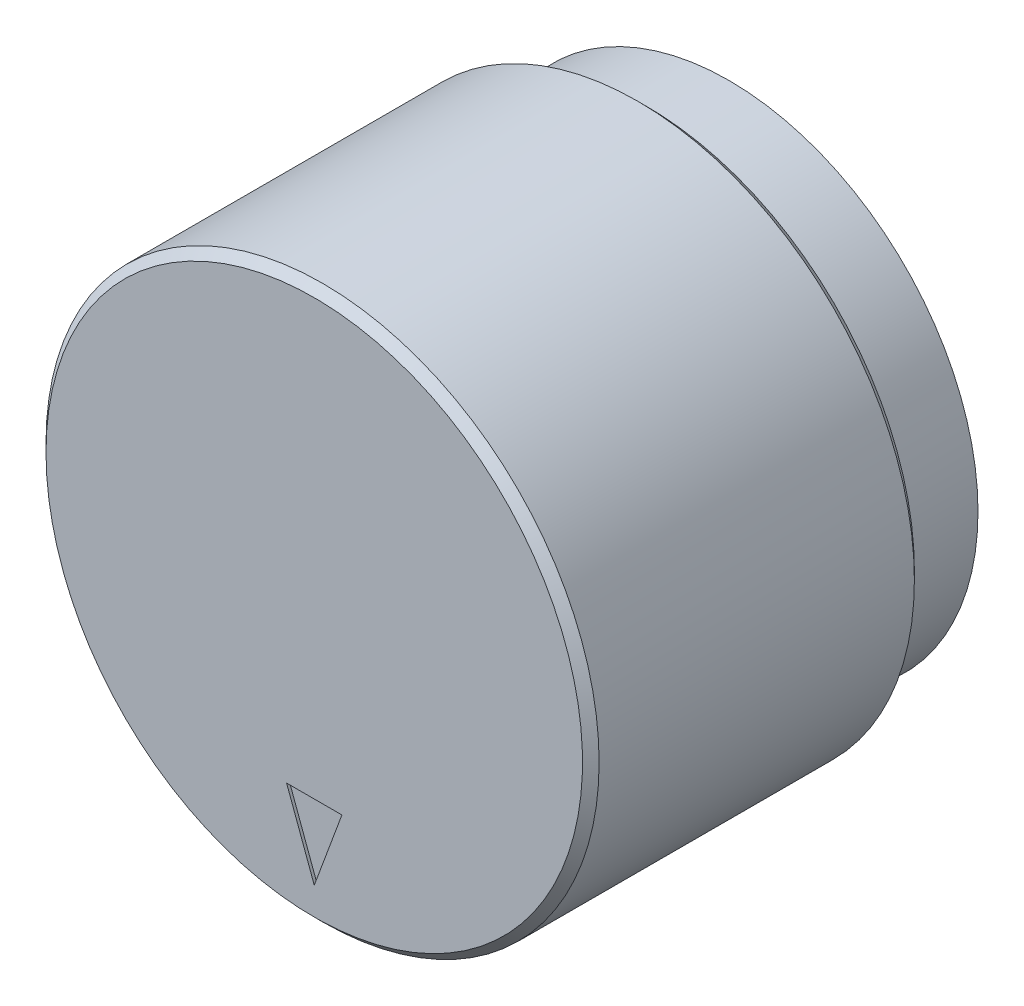
ISO-10303-21;
HEADER;
FILE_DESCRIPTION(('STEP AP214'),'2;1');
FILE_NAME('part.step','',(''),(''),'','','');
FILE_SCHEMA(('AUTOMOTIVE_DESIGN { 1 0 10303 214 1 1 1 1 }'));
ENDSEC;
DATA;
#1=APPLICATION_CONTEXT('core data for automotive mechanical design processes');
#2=APPLICATION_PROTOCOL_DEFINITION('international standard','automotive_design',2000,#1);
#3=PRODUCT_CONTEXT('',#1,'mechanical');
#4=PRODUCT('Part','Part','',(#3));
#5=PRODUCT_RELATED_PRODUCT_CATEGORY('part','',(#4));
#6=PRODUCT_DEFINITION_FORMATION('','',#4);
#7=PRODUCT_DEFINITION_CONTEXT('part definition',#1,'design');
#8=PRODUCT_DEFINITION('design','',#6,#7);
#9=PRODUCT_DEFINITION_SHAPE('','',#8);
#10=(LENGTH_UNIT() NAMED_UNIT(*) SI_UNIT(.MILLI.,.METRE.));
#11=(NAMED_UNIT(*) PLANE_ANGLE_UNIT() SI_UNIT($,.RADIAN.));
#12=(NAMED_UNIT(*) SI_UNIT($,.STERADIAN.) SOLID_ANGLE_UNIT());
#13=UNCERTAINTY_MEASURE_WITH_UNIT(LENGTH_MEASURE(1.E-05),#10,'distance_accuracy_value','');
#14=(GEOMETRIC_REPRESENTATION_CONTEXT(3) GLOBAL_UNCERTAINTY_ASSIGNED_CONTEXT((#13)) GLOBAL_UNIT_ASSIGNED_CONTEXT((#10,
#11,#12)) REPRESENTATION_CONTEXT('',''));
#15=CARTESIAN_POINT('',(0.,0.,0.));
#16=DIRECTION('',(0.,0.,1.));
#17=DIRECTION('',(1.,0.,0.));
#18=AXIS2_PLACEMENT_3D('',#15,#16,#17);
#19=CARTESIAN_POINT('',(0.,0.,12.));
#20=DIRECTION('',(0.,0.,-1.));
#21=DIRECTION('',(-1.,0.,0.));
#22=AXIS2_PLACEMENT_3D('',#19,#20,#21);
#23=CYLINDRICAL_SURFACE('',#22,10.);
#24=CARTESIAN_POINT('',(0.,0.,11.7));
#25=DIRECTION('',(0.,0.,1.));
#26=DIRECTION('',(1.,0.,0.));
#27=AXIS2_PLACEMENT_3D('',#24,#25,#26);
#28=CIRCLE('',#27,10.);
#29=CARTESIAN_POINT('',(-10.,0.,11.7));
#30=VERTEX_POINT('',#29);
#31=EDGE_CURVE('E63',#30,#30,#28,.F.);
#32=ORIENTED_EDGE('',*,*,#31,.T.);
#33=EDGE_LOOP('',(#32));
#34=FACE_BOUND('',#33,.T.);
#35=CARTESIAN_POINT('',(0.,0.,0.299999999999996));
#36=DIRECTION('',(0.,0.,1.));
#37=DIRECTION('',(1.,0.,0.));
#38=AXIS2_PLACEMENT_3D('',#35,#36,#37);
#39=CIRCLE('',#38,10.);
#40=CARTESIAN_POINT('',(10.,0.,0.299999999999996));
#41=VERTEX_POINT('',#40);
#42=EDGE_CURVE('E153',#41,#41,#39,.T.);
#43=ORIENTED_EDGE('',*,*,#42,.T.);
#44=EDGE_LOOP('',(#43));
#45=FACE_BOUND('',#44,.T.);
#46=ADVANCED_FACE('F53',(#34,#45),#23,.T.);
#47=CARTESIAN_POINT('',(0.,0.,12.));
#48=DIRECTION('',(0.,0.,1.));
#49=DIRECTION('',(1.,0.,0.));
#50=AXIS2_PLACEMENT_3D('',#47,#48,#49);
#51=PLANE('',#50);
#52=DIRECTION('',(0.347314355823595,-0.937748760723703,0.));
#53=VECTOR('',#52,1.);
#54=CARTESIAN_POINT('',(-0.999999999999998,-6.,12.));
#55=LINE('',#54,#53);
#56=CARTESIAN_POINT('',(-0.999999999999998,-6.,12.));
#57=VERTEX_POINT('',#56);
#58=CARTESIAN_POINT('',(0.,-8.7,12.));
#59=VERTEX_POINT('',#58);
#60=EDGE_CURVE('E70',#57,#59,#55,.T.);
#61=ORIENTED_EDGE('',*,*,#60,.F.);
#62=DIRECTION('',(-1.,0.,0.));
#63=VECTOR('',#62,1.);
#64=CARTESIAN_POINT('',(-0.999999999999998,-6.,12.));
#65=LINE('',#64,#63);
#66=CARTESIAN_POINT('',(1.,-6.,12.));
#67=VERTEX_POINT('',#66);
#68=EDGE_CURVE('E109',#67,#57,#65,.T.);
#69=ORIENTED_EDGE('',*,*,#68,.F.);
#70=DIRECTION('',(0.347314355823595,0.937748760723703,0.));
#71=VECTOR('',#70,1.);
#72=CARTESIAN_POINT('',(0.,-8.7,12.));
#73=LINE('',#72,#71);
#74=EDGE_CURVE('E112',#59,#67,#73,.T.);
#75=ORIENTED_EDGE('',*,*,#74,.F.);
#76=EDGE_LOOP('',(#61,#69,#75));
#77=FACE_BOUND('',#76,.T.);
#78=CARTESIAN_POINT('',(0.,0.,12.));
#79=DIRECTION('',(0.,0.,1.));
#80=DIRECTION('',(1.,0.,0.));
#81=AXIS2_PLACEMENT_3D('',#78,#79,#80);
#82=CIRCLE('',#81,9.7);
#83=CARTESIAN_POINT('',(-9.7,0.,12.));
#84=VERTEX_POINT('',#83);
#85=EDGE_CURVE('E149',#84,#84,#82,.T.);
#86=ORIENTED_EDGE('',*,*,#85,.T.);
#87=EDGE_LOOP('',(#86));
#88=FACE_BOUND('',#87,.T.);
#89=ADVANCED_FACE('F168',(#77,#88),#51,.T.);
#90=CARTESIAN_POINT('',(0.,0.,0.));
#91=DIRECTION('',(0.,0.,1.));
#92=DIRECTION('',(1.,0.,0.));
#93=AXIS2_PLACEMENT_3D('',#90,#91,#92);
#94=PLANE('',#93);
#95=CARTESIAN_POINT('',(0.,0.,0.));
#96=DIRECTION('',(0.,0.,1.));
#97=DIRECTION('',(1.,0.,0.));
#98=AXIS2_PLACEMENT_3D('',#95,#96,#97);
#99=CIRCLE('',#98,9.7);
#100=CARTESIAN_POINT('',(9.7,0.,0.));
#101=VERTEX_POINT('',#100);
#102=EDGE_CURVE('E11',#101,#101,#99,.F.);
#103=ORIENTED_EDGE('',*,*,#102,.T.);
#104=EDGE_LOOP('',(#103));
#105=FACE_BOUND('',#104,.T.);
#106=CARTESIAN_POINT('',(0.,0.,0.));
#107=DIRECTION('',(0.,0.,1.));
#108=DIRECTION('',(1.,0.,0.));
#109=AXIS2_PLACEMENT_3D('',#106,#107,#108);
#110=CIRCLE('',#109,9.);
#111=CARTESIAN_POINT('',(9.,0.,0.));
#112=VERTEX_POINT('',#111);
#113=EDGE_CURVE('E145',#112,#112,#110,.F.);
#114=ORIENTED_EDGE('',*,*,#113,.F.);
#115=EDGE_LOOP('',(#114));
#116=FACE_BOUND('',#115,.T.);
#117=ADVANCED_FACE('F170',(#105,#116),#94,.F.);
#118=CARTESIAN_POINT('',(0.,0.,-3.));
#119=DIRECTION('',(0.,0.,-1.));
#120=DIRECTION('',(-1.,0.,0.));
#121=AXIS2_PLACEMENT_3D('',#118,#119,#120);
#122=PLANE('',#121);
#123=CARTESIAN_POINT('',(0.,0.,-3.));
#124=DIRECTION('',(0.,0.,-1.));
#125=DIRECTION('',(-1.,0.,0.));
#126=AXIS2_PLACEMENT_3D('',#123,#124,#125);
#127=CIRCLE('',#126,9.);
#128=CARTESIAN_POINT('',(-9.,0.,-3.));
#129=VERTEX_POINT('',#128);
#130=EDGE_CURVE('E138',#129,#129,#127,.T.);
#131=ORIENTED_EDGE('',*,*,#130,.T.);
#132=EDGE_LOOP('',(#131));
#133=FACE_BOUND('',#132,.T.);
#134=CARTESIAN_POINT('',(0.,0.,-3.));
#135=DIRECTION('',(0.,0.,-1.));
#136=DIRECTION('',(-1.,0.,0.));
#137=AXIS2_PLACEMENT_3D('',#134,#135,#136);
#138=CIRCLE('',#137,8.);
#139=CARTESIAN_POINT('',(-8.,0.,-3.));
#140=VERTEX_POINT('',#139);
#141=EDGE_CURVE('E134',#140,#140,#138,.T.);
#142=ORIENTED_EDGE('',*,*,#141,.F.);
#143=EDGE_LOOP('',(#142));
#144=FACE_BOUND('',#143,.T.);
#145=ADVANCED_FACE('F178',(#133,#144),#122,.T.);
#146=CARTESIAN_POINT('',(0.,0.,-3.));
#147=DIRECTION('',(0.,0.,1.));
#148=DIRECTION('',(1.,0.,0.));
#149=AXIS2_PLACEMENT_3D('',#146,#147,#148);
#150=CYLINDRICAL_SURFACE('',#149,9.);
#151=ORIENTED_EDGE('',*,*,#130,.F.);
#152=EDGE_LOOP('',(#151));
#153=FACE_BOUND('',#152,.T.);
#154=ORIENTED_EDGE('',*,*,#113,.T.);
#155=EDGE_LOOP('',(#154));
#156=FACE_BOUND('',#155,.T.);
#157=ADVANCED_FACE('F185',(#153,#156),#150,.T.);
#158=CARTESIAN_POINT('',(0.,0.,-3.));
#159=DIRECTION('',(0.,0.,1.));
#160=DIRECTION('',(1.,0.,0.));
#161=AXIS2_PLACEMENT_3D('',#158,#159,#160);
#162=CYLINDRICAL_SURFACE('',#161,8.);
#163=ORIENTED_EDGE('',*,*,#141,.T.);
#164=EDGE_LOOP('',(#163));
#165=FACE_BOUND('',#164,.T.);
#166=CARTESIAN_POINT('',(0.,0.,0.));
#167=DIRECTION('',(0.,0.,-1.));
#168=DIRECTION('',(-1.,0.,0.));
#169=AXIS2_PLACEMENT_3D('',#166,#167,#168);
#170=CIRCLE('',#169,8.);
#171=CARTESIAN_POINT('',(-8.,0.,0.));
#172=VERTEX_POINT('',#171);
#173=EDGE_CURVE('E130',#172,#172,#170,.T.);
#174=ORIENTED_EDGE('',*,*,#173,.F.);
#175=EDGE_LOOP('',(#174));
#176=FACE_BOUND('',#175,.T.);
#177=ADVANCED_FACE('F193',(#165,#176),#162,.F.);
#178=CARTESIAN_POINT('',(0.,0.,0.));
#179=DIRECTION('',(0.,0.,-1.));
#180=DIRECTION('',(-1.,0.,0.));
#181=AXIS2_PLACEMENT_3D('',#178,#179,#180);
#182=CIRCLE('',#181,3.);
#183=CARTESIAN_POINT('',(-3.,0.,0.));
#184=VERTEX_POINT('',#183);
#185=EDGE_CURVE('E123',#184,#184,#182,.T.);
#186=ORIENTED_EDGE('',*,*,#185,.F.);
#187=EDGE_LOOP('',(#186));
#188=FACE_BOUND('',#187,.T.);
#189=ORIENTED_EDGE('',*,*,#173,.T.);
#190=EDGE_LOOP('',(#189));
#191=FACE_BOUND('',#190,.T.);
#192=ADVANCED_FACE('F181',(#188,#191),#94,.F.);
#193=CARTESIAN_POINT('',(0.,0.,10.));
#194=DIRECTION('',(0.,0.,-1.));
#195=DIRECTION('',(-1.,0.,0.));
#196=AXIS2_PLACEMENT_3D('',#193,#194,#195);
#197=CYLINDRICAL_SURFACE('',#196,3.);
#198=CARTESIAN_POINT('',(0.,0.,10.));
#199=DIRECTION('',(0.,0.,-1.));
#200=DIRECTION('',(-1.,0.,0.));
#201=AXIS2_PLACEMENT_3D('',#198,#199,#200);
#202=CIRCLE('',#201,3.);
#203=CARTESIAN_POINT('',(-3.,0.,10.));
#204=VERTEX_POINT('',#203);
#205=EDGE_CURVE('E126',#204,#204,#202,.T.);
#206=ORIENTED_EDGE('',*,*,#205,.F.);
#207=EDGE_LOOP('',(#206));
#208=FACE_BOUND('',#207,.T.);
#209=ORIENTED_EDGE('',*,*,#185,.T.);
#210=EDGE_LOOP('',(#209));
#211=FACE_BOUND('',#210,.T.);
#212=ADVANCED_FACE('F201',(#208,#211),#197,.F.);
#213=CARTESIAN_POINT('',(0.,0.,10.));
#214=DIRECTION('',(0.,0.,-1.));
#215=DIRECTION('',(-1.,0.,0.));
#216=AXIS2_PLACEMENT_3D('',#213,#214,#215);
#217=PLANE('',#216);
#218=ORIENTED_EDGE('',*,*,#205,.T.);
#219=EDGE_LOOP('',(#218));
#220=FACE_BOUND('',#219,.T.);
#221=ADVANCED_FACE('F165',(#220),#217,.T.);
#222=CARTESIAN_POINT('',(0.,0.,12.));
#223=DIRECTION('',(0.,0.,-1.));
#224=DIRECTION('',(-1.,0.,0.));
#225=AXIS2_PLACEMENT_3D('',#222,#223,#224);
#226=CONICAL_SURFACE('',#225,9.7,0.785398163397443);
#227=CARTESIAN_POINT('',(-10.,0.,11.7));
#228=CARTESIAN_POINT('',(-9.996875,0.,11.703125));
#229=CARTESIAN_POINT('',(-9.99375,0.,11.70625));
#230=CARTESIAN_POINT('',(-9.9875,0.,11.7125));
#231=CARTESIAN_POINT('',(-9.984375,0.,11.715625));
#232=CARTESIAN_POINT('',(-9.978125,0.,11.721875));
#233=CARTESIAN_POINT('',(-9.975,0.,11.725));
#234=CARTESIAN_POINT('',(-9.96875,0.,11.73125));
#235=CARTESIAN_POINT('',(-9.965625,0.,11.734375));
#236=CARTESIAN_POINT('',(-9.959375,0.,11.740625));
#237=CARTESIAN_POINT('',(-9.95625,0.,11.74375));
#238=CARTESIAN_POINT('',(-9.95,0.,11.75));
#239=CARTESIAN_POINT('',(-9.946875,0.,11.753125));
#240=CARTESIAN_POINT('',(-9.940625,0.,11.759375));
#241=CARTESIAN_POINT('',(-9.9375,0.,11.7625));
#242=CARTESIAN_POINT('',(-9.93125,0.,11.76875));
#243=CARTESIAN_POINT('',(-9.928125,0.,11.771875));
#244=CARTESIAN_POINT('',(-9.921875,0.,11.778125));
#245=CARTESIAN_POINT('',(-9.91875,0.,11.78125));
#246=CARTESIAN_POINT('',(-9.9125,0.,11.7875));
#247=CARTESIAN_POINT('',(-9.909375,0.,11.790625));
#248=CARTESIAN_POINT('',(-9.903125,0.,11.796875));
#249=CARTESIAN_POINT('',(-9.9,0.,11.8));
#250=CARTESIAN_POINT('',(-9.89375,0.,11.80625));
#251=CARTESIAN_POINT('',(-9.890625,0.,11.809375));
#252=CARTESIAN_POINT('',(-9.884375,0.,11.815625));
#253=CARTESIAN_POINT('',(-9.88125,0.,11.81875));
#254=CARTESIAN_POINT('',(-9.875,0.,11.825));
#255=CARTESIAN_POINT('',(-9.871875,0.,11.828125));
#256=CARTESIAN_POINT('',(-9.865625,0.,11.834375));
#257=CARTESIAN_POINT('',(-9.8625,0.,11.8375));
#258=CARTESIAN_POINT('',(-9.85625,0.,11.84375));
#259=CARTESIAN_POINT('',(-9.853125,0.,11.846875));
#260=CARTESIAN_POINT('',(-9.846875,0.,11.853125));
#261=CARTESIAN_POINT('',(-9.84375,0.,11.85625));
#262=CARTESIAN_POINT('',(-9.8375,0.,11.8625));
#263=CARTESIAN_POINT('',(-9.834375,0.,11.865625));
#264=CARTESIAN_POINT('',(-9.828125,0.,11.871875));
#265=CARTESIAN_POINT('',(-9.825,0.,11.875));
#266=CARTESIAN_POINT('',(-9.81875,0.,11.88125));
#267=CARTESIAN_POINT('',(-9.815625,0.,11.884375));
#268=CARTESIAN_POINT('',(-9.809375,0.,11.890625));
#269=CARTESIAN_POINT('',(-9.80625,0.,11.89375));
#270=CARTESIAN_POINT('',(-9.8,0.,11.9));
#271=CARTESIAN_POINT('',(-9.796875,0.,11.903125));
#272=CARTESIAN_POINT('',(-9.790625,0.,11.909375));
#273=CARTESIAN_POINT('',(-9.7875,0.,11.9125));
#274=CARTESIAN_POINT('',(-9.78125,0.,11.91875));
#275=CARTESIAN_POINT('',(-9.778125,0.,11.921875));
#276=CARTESIAN_POINT('',(-9.771875,0.,11.928125));
#277=CARTESIAN_POINT('',(-9.76875,0.,11.93125));
#278=CARTESIAN_POINT('',(-9.7625,0.,11.9375));
#279=CARTESIAN_POINT('',(-9.759375,0.,11.940625));
#280=CARTESIAN_POINT('',(-9.753125,0.,11.946875));
#281=CARTESIAN_POINT('',(-9.75,0.,11.95));
#282=CARTESIAN_POINT('',(-9.74375,0.,11.95625));
#283=CARTESIAN_POINT('',(-9.740625,0.,11.959375));
#284=CARTESIAN_POINT('',(-9.734375,0.,11.965625));
#285=CARTESIAN_POINT('',(-9.73125,0.,11.96875));
#286=CARTESIAN_POINT('',(-9.725,0.,11.975));
#287=CARTESIAN_POINT('',(-9.721875,0.,11.978125));
#288=CARTESIAN_POINT('',(-9.715625,0.,11.984375));
#289=CARTESIAN_POINT('',(-9.7125,0.,11.9875));
#290=CARTESIAN_POINT('',(-9.70625,0.,11.99375));
#291=CARTESIAN_POINT('',(-9.703125,0.,11.996875));
#292=CARTESIAN_POINT('',(-9.7,0.,12.));
#293=B_SPLINE_CURVE_WITH_KNOTS('',3,(#227,#228,#229,#230,#231,#232,#233,#234,#235,#236,#237,
#238,#239,#240,#241,#242,#243,#244,#245,#246,#247,#248,#249,#250,#251,#252,#253,#254,#255,#256,
#257,#258,#259,#260,#261,#262,#263,#264,#265,#266,#267,#268,#269,#270,#271,#272,#273,#274,#275,
#276,#277,#278,#279,#280,#281,#282,#283,#284,#285,#286,#287,#288,#289,#290,#291,#292),
.UNSPECIFIED.,.F.,.F.,(4,2,2,2,2,2,2,2,2,2,2,2,2,2,2,2,2,2,2,2,2,2,2,2,2,2,2,2,2,2,2,2,4),(0.,
0.0132582521472488,0.0265165042944975,0.0397747564417451,0.0530330085889926,0.0662912607362414,
0.0795495128834889,0.0928077650307364,0.106066017177984,0.119324269325233,0.13258252147248,
0.145840773619728,0.159099025766977,0.172357277914224,0.185615530061472,0.19887378220872,
0.212132034355967,0.225390286503215,0.238648538650464,0.251906790797712,0.265165042944959,
0.278423295092208,0.291681547239456,0.304939799386703,0.318198051533951,0.331456303681199,
0.344714555828447,0.357972807975694,0.371231060122943,0.384489312270191,0.397747564417438,
0.411005816564687,0.424264068711936),.UNSPECIFIED.);
#294=EDGE_CURVE('BSEAM162',#30,#84,#293,.T.);
#295=ORIENTED_EDGE('',*,*,#31,.F.);
#296=ORIENTED_EDGE('',*,*,#85,.F.);
#297=ORIENTED_EDGE('',*,*,#294,.T.);
#298=ORIENTED_EDGE('',*,*,#294,.F.);
#299=EDGE_LOOP('',(#295,#297,#296,#298));
#300=FACE_BOUND('',#299,.T.);
#301=ADVANCED_FACE('F162',(#300),#226,.T.);
#302=CARTESIAN_POINT('',(0.,0.,0.299999999999996));
#303=DIRECTION('',(0.,0.,1.));
#304=DIRECTION('',(1.,0.,0.));
#305=AXIS2_PLACEMENT_3D('',#302,#303,#304);
#306=CONICAL_SURFACE('',#305,10.,0.785398163397448);
#307=ORIENTED_EDGE('',*,*,#102,.F.);
#308=EDGE_LOOP('',(#307));
#309=FACE_BOUND('',#308,.T.);
#310=ORIENTED_EDGE('',*,*,#42,.F.);
#311=EDGE_LOOP('',(#310));
#312=FACE_BOUND('',#311,.T.);
#313=ADVANCED_FACE('F56',(#309,#312),#306,.T.);
#314=CARTESIAN_POINT('',(-0.999999999999998,-6.,11.9));
#315=DIRECTION('',(-0.937748760723703,-0.347314355823595,0.));
#316=DIRECTION('',(0.347314355823595,-0.937748760723703,0.));
#317=AXIS2_PLACEMENT_3D('',#314,#315,#316);
#318=PLANE('',#317);
#319=ORIENTED_EDGE('',*,*,#60,.T.);
#320=DIRECTION('',(0.,0.,1.));
#321=VECTOR('',#320,1.);
#322=CARTESIAN_POINT('',(0.,-8.7,11.9));
#323=LINE('',#322,#321);
#324=CARTESIAN_POINT('',(0.,-8.7,11.9));
#325=VERTEX_POINT('',#324);
#326=EDGE_CURVE('E88',#325,#59,#323,.T.);
#327=ORIENTED_EDGE('',*,*,#326,.F.);
#328=DIRECTION('',(0.347314355823595,-0.937748760723703,0.));
#329=VECTOR('',#328,1.);
#330=CARTESIAN_POINT('',(-0.999999999999998,-6.,11.9));
#331=LINE('',#330,#329);
#332=CARTESIAN_POINT('',(-0.999999999999998,-6.,11.9));
#333=VERTEX_POINT('',#332);
#334=EDGE_CURVE('E92',#333,#325,#331,.T.);
#335=ORIENTED_EDGE('',*,*,#334,.F.);
#336=DIRECTION('',(0.,0.,1.));
#337=VECTOR('',#336,1.);
#338=CARTESIAN_POINT('',(-0.999999999999998,-6.,11.9));
#339=LINE('',#338,#337);
#340=EDGE_CURVE('E78',#333,#57,#339,.T.);
#341=ORIENTED_EDGE('',*,*,#340,.T.);
#342=EDGE_LOOP('',(#319,#327,#335,#341));
#343=FACE_BOUND('',#342,.T.);
#344=ADVANCED_FACE('F90',(#343),#318,.F.);
#345=CARTESIAN_POINT('',(-0.999999999999998,-6.,11.9));
#346=DIRECTION('',(0.,1.,0.));
#347=DIRECTION('',(0.,0.,1.));
#348=AXIS2_PLACEMENT_3D('',#345,#346,#347);
#349=PLANE('',#348);
#350=ORIENTED_EDGE('',*,*,#68,.T.);
#351=ORIENTED_EDGE('',*,*,#340,.F.);
#352=DIRECTION('',(-1.,0.,0.));
#353=VECTOR('',#352,1.);
#354=CARTESIAN_POINT('',(-0.999999999999998,-6.,11.9));
#355=LINE('',#354,#353);
#356=CARTESIAN_POINT('',(1.,-6.,11.9));
#357=VERTEX_POINT('',#356);
#358=EDGE_CURVE('E99',#357,#333,#355,.T.);
#359=ORIENTED_EDGE('',*,*,#358,.F.);
#360=DIRECTION('',(0.,0.,1.));
#361=VECTOR('',#360,1.);
#362=CARTESIAN_POINT('',(1.,-6.,11.9));
#363=LINE('',#362,#361);
#364=EDGE_CURVE('E98',#357,#67,#363,.T.);
#365=ORIENTED_EDGE('',*,*,#364,.T.);
#366=EDGE_LOOP('',(#350,#351,#359,#365));
#367=FACE_BOUND('',#366,.T.);
#368=ADVANCED_FACE('F209',(#367),#349,.F.);
#369=CARTESIAN_POINT('',(0.,-8.7,11.9));
#370=DIRECTION('',(0.937748760723703,-0.347314355823595,0.));
#371=DIRECTION('',(0.347314355823595,0.937748760723703,0.));
#372=AXIS2_PLACEMENT_3D('',#369,#370,#371);
#373=PLANE('',#372);
#374=ORIENTED_EDGE('',*,*,#74,.T.);
#375=ORIENTED_EDGE('',*,*,#364,.F.);
#376=DIRECTION('',(0.347314355823595,0.937748760723703,0.));
#377=VECTOR('',#376,1.);
#378=CARTESIAN_POINT('',(0.,-8.7,11.9));
#379=LINE('',#378,#377);
#380=EDGE_CURVE('E102',#325,#357,#379,.T.);
#381=ORIENTED_EDGE('',*,*,#380,.F.);
#382=ORIENTED_EDGE('',*,*,#326,.T.);
#383=EDGE_LOOP('',(#374,#375,#381,#382));
#384=FACE_BOUND('',#383,.T.);
#385=ADVANCED_FACE('F103',(#384),#373,.F.);
#386=CARTESIAN_POINT('',(0.,0.,11.9));
#387=DIRECTION('',(0.,0.,1.));
#388=DIRECTION('',(1.,0.,0.));
#389=AXIS2_PLACEMENT_3D('',#386,#387,#388);
#390=PLANE('',#389);
#391=ORIENTED_EDGE('',*,*,#334,.T.);
#392=ORIENTED_EDGE('',*,*,#380,.T.);
#393=ORIENTED_EDGE('',*,*,#358,.T.);
#394=EDGE_LOOP('',(#391,#392,#393));
#395=FACE_BOUND('',#394,.T.);
#396=ADVANCED_FACE('F107',(#395),#390,.T.);
#397=CLOSED_SHELL('',(#46,#89,#117,#145,#157,#177,#192,#212,#221,#301,#313,#344,#368,#385,#396));
#398=MANIFOLD_SOLID_BREP('B2',#397);
#399=ADVANCED_BREP_SHAPE_REPRESENTATION('',(#18,#398),#14);
#400=SHAPE_DEFINITION_REPRESENTATION(#9,#399);
ENDSEC;
END-ISO-10303-21;
